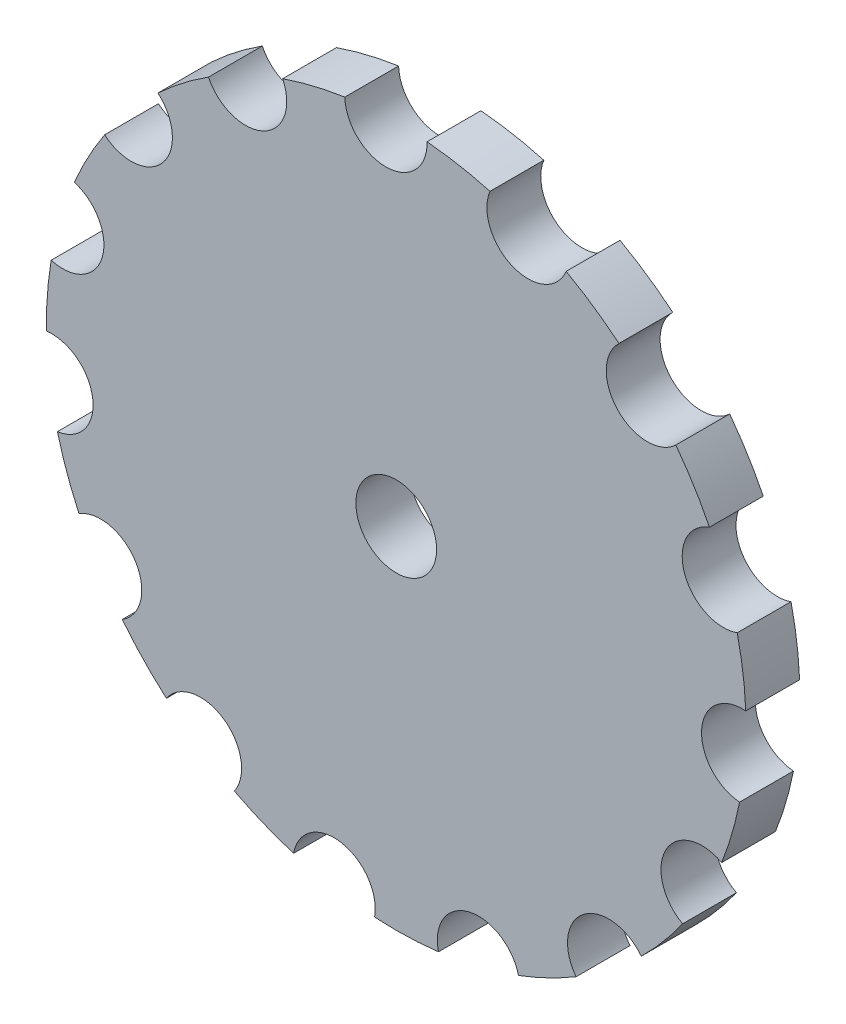
ISO-10303-21;
HEADER;
FILE_DESCRIPTION(('STEP AP214'),'2;1');
FILE_NAME('part.step','',(''),(''),'','','');
FILE_SCHEMA(('AUTOMOTIVE_DESIGN { 1 0 10303 214 1 1 1 1 }'));
ENDSEC;
DATA;
#1=APPLICATION_CONTEXT('core data for automotive mechanical design processes');
#2=APPLICATION_PROTOCOL_DEFINITION('international standard','automotive_design',2000,#1);
#3=PRODUCT_CONTEXT('',#1,'mechanical');
#4=PRODUCT('Part','Part','',(#3));
#5=PRODUCT_RELATED_PRODUCT_CATEGORY('part','',(#4));
#6=PRODUCT_DEFINITION_FORMATION('','',#4);
#7=PRODUCT_DEFINITION_CONTEXT('part definition',#1,'design');
#8=PRODUCT_DEFINITION('design','',#6,#7);
#9=PRODUCT_DEFINITION_SHAPE('','',#8);
#10=(LENGTH_UNIT() NAMED_UNIT(*) SI_UNIT(.MILLI.,.METRE.));
#11=(NAMED_UNIT(*) PLANE_ANGLE_UNIT() SI_UNIT($,.RADIAN.));
#12=(NAMED_UNIT(*) SI_UNIT($,.STERADIAN.) SOLID_ANGLE_UNIT());
#13=UNCERTAINTY_MEASURE_WITH_UNIT(LENGTH_MEASURE(1.E-05),#10,'distance_accuracy_value','');
#14=(GEOMETRIC_REPRESENTATION_CONTEXT(3) GLOBAL_UNCERTAINTY_ASSIGNED_CONTEXT((#13)) GLOBAL_UNIT_ASSIGNED_CONTEXT((#10,
#11,#12)) REPRESENTATION_CONTEXT('',''));
#15=CARTESIAN_POINT('',(0.,0.,0.));
#16=DIRECTION('',(0.,0.,1.));
#17=DIRECTION('',(1.,0.,0.));
#18=AXIS2_PLACEMENT_3D('',#15,#16,#17);
#19=CARTESIAN_POINT('',(0.,0.,10.));
#20=DIRECTION('',(0.,0.,-1.));
#21=DIRECTION('',(-1.,0.,0.));
#22=AXIS2_PLACEMENT_3D('',#19,#20,#21);
#23=CYLINDRICAL_SURFACE('',#22,65.);
#24=DIRECTION('',(0.,0.,-1.));
#25=VECTOR('',#24,1.);
#26=CARTESIAN_POINT('',(5.73085108240576,64.7468713211016,10.));
#27=LINE('',#26,#25);
#28=CARTESIAN_POINT('',(5.73085108240576,64.7468713211016,10.));
#29=VERTEX_POINT('',#28);
#30=CARTESIAN_POINT('',(5.73085108240576,64.7468713211016,0.));
#31=VERTEX_POINT('',#30);
#32=EDGE_CURVE('E505',#29,#31,#27,.T.);
#33=ORIENTED_EDGE('',*,*,#32,.F.);
#34=CARTESIAN_POINT('',(0.,0.,10.));
#35=DIRECTION('',(0.,0.,1.));
#36=DIRECTION('',(1.,0.,0.));
#37=AXIS2_PLACEMENT_3D('',#34,#35,#36);
#38=CIRCLE('',#37,65.);
#39=CARTESIAN_POINT('',(17.4188708905974,62.6225433601726,10.));
#40=VERTEX_POINT('',#39);
#41=EDGE_CURVE('E585',#40,#29,#38,.T.);
#42=ORIENTED_EDGE('',*,*,#41,.F.);
#43=DIRECTION('',(0.,0.,-1.));
#44=VECTOR('',#43,1.);
#45=CARTESIAN_POINT('',(17.4188708905974,62.6225433601726,10.));
#46=LINE('',#45,#44);
#47=CARTESIAN_POINT('',(17.4188708905974,62.6225433601726,0.));
#48=VERTEX_POINT('',#47);
#49=EDGE_CURVE('E502',#40,#48,#46,.T.);
#50=ORIENTED_EDGE('',*,*,#49,.T.);
#51=CARTESIAN_POINT('',(0.,0.,0.));
#52=DIRECTION('',(0.,0.,1.));
#53=DIRECTION('',(1.,0.,0.));
#54=AXIS2_PLACEMENT_3D('',#51,#52,#53);
#55=CIRCLE('',#54,65.);
#56=EDGE_CURVE('E345',#48,#31,#55,.T.);
#57=ORIENTED_EDGE('',*,*,#56,.T.);
#58=EDGE_LOOP('',(#33,#42,#50,#57));
#59=FACE_BOUND('',#58,.T.);
#60=ADVANCED_FACE('F40',(#59),#23,.T.);
#61=DIRECTION('',(0.,0.,-1.));
#62=VECTOR('',#61,1.);
#63=CARTESIAN_POINT('',(-9.55795268781716,64.2934331049249,10.));
#64=LINE('',#63,#62);
#65=CARTESIAN_POINT('',(-9.55795268781716,64.2934331049249,10.));
#66=VERTEX_POINT('',#65);
#67=CARTESIAN_POINT('',(-9.55795268781716,64.2934331049249,0.));
#68=VERTEX_POINT('',#67);
#69=EDGE_CURVE('E566',#66,#68,#64,.T.);
#70=ORIENTED_EDGE('',*,*,#69,.T.);
#71=CARTESIAN_POINT('',(-21.0995321160477,61.4801573231874,0.));
#72=VERTEX_POINT('',#71);
#73=EDGE_CURVE('E338',#68,#72,#55,.T.);
#74=ORIENTED_EDGE('',*,*,#73,.T.);
#75=DIRECTION('',(0.,0.,-1.));
#76=VECTOR('',#75,1.);
#77=CARTESIAN_POINT('',(-21.0995321160477,61.4801573231874,10.));
#78=LINE('',#77,#76);
#79=CARTESIAN_POINT('',(-21.0995321160477,61.4801573231874,10.));
#80=VERTEX_POINT('',#79);
#81=EDGE_CURVE('E419',#80,#72,#78,.T.);
#82=ORIENTED_EDGE('',*,*,#81,.F.);
#83=EDGE_CURVE('E581',#66,#80,#38,.T.);
#84=ORIENTED_EDGE('',*,*,#83,.F.);
#85=EDGE_LOOP('',(#70,#74,#82,#84));
#86=FACE_BOUND('',#85,.T.);
#87=ADVANCED_FACE('F651',(#86),#23,.T.);
#88=DIRECTION('',(0.,0.,-1.));
#89=VECTOR('',#88,1.);
#90=CARTESIAN_POINT('',(-34.8821194152339,54.8474041783325,10.));
#91=LINE('',#90,#89);
#92=CARTESIAN_POINT('',(-34.8821194152339,54.8474041783325,10.));
#93=VERTEX_POINT('',#92);
#94=CARTESIAN_POINT('',(-34.8821194152339,54.8474041783325,0.));
#95=VERTEX_POINT('',#94);
#96=EDGE_CURVE('E417',#93,#95,#91,.T.);
#97=ORIENTED_EDGE('',*,*,#96,.T.);
#98=CARTESIAN_POINT('',(-44.2816145284048,47.5829655943991,0.));
#99=VERTEX_POINT('',#98);
#100=EDGE_CURVE('E291',#95,#99,#55,.T.);
#101=ORIENTED_EDGE('',*,*,#100,.T.);
#102=DIRECTION('',(0.,0.,-1.));
#103=VECTOR('',#102,1.);
#104=CARTESIAN_POINT('',(-44.2816145284049,47.5829655943991,10.));
#105=LINE('',#104,#103);
#106=CARTESIAN_POINT('',(-44.2816145284049,47.5829655943991,10.));
#107=VERTEX_POINT('',#106);
#108=EDGE_CURVE('E425',#107,#99,#105,.T.);
#109=ORIENTED_EDGE('',*,*,#108,.F.);
#110=EDGE_CURVE('E423',#93,#107,#38,.T.);
#111=ORIENTED_EDGE('',*,*,#110,.F.);
#112=EDGE_LOOP('',(#97,#101,#109,#111));
#113=FACE_BOUND('',#112,.T.);
#114=ADVANCED_FACE('F421',(#113),#23,.T.);
#115=DIRECTION('',(0.,0.,-1.));
#116=VECTOR('',#115,1.);
#117=CARTESIAN_POINT('',(-54.1748508016503,35.917760796282,10.));
#118=LINE('',#117,#116);
#119=CARTESIAN_POINT('',(-54.1748508016503,35.917760796282,10.));
#120=VERTEX_POINT('',#119);
#121=CARTESIAN_POINT('',(-54.1748508016503,35.917760796282,0.));
#122=VERTEX_POINT('',#121);
#123=EDGE_CURVE('E444',#120,#122,#118,.T.);
#124=ORIENTED_EDGE('',*,*,#123,.T.);
#125=CARTESIAN_POINT('',(0.,0.,0.));
#126=DIRECTION('',(0.,0.,-1.));
#127=DIRECTION('',(-1.,0.,0.));
#128=AXIS2_PLACEMENT_3D('',#125,#126,#127);
#129=CIRCLE('',#128,65.);
#130=CARTESIAN_POINT('',(-59.807003502962,25.4582468366675,0.));
#131=VERTEX_POINT('',#130);
#132=EDGE_CURVE('E43',#122,#131,#129,.F.);
#133=ORIENTED_EDGE('',*,*,#132,.T.);
#134=DIRECTION('',(0.,0.,-1.));
#135=VECTOR('',#134,1.);
#136=CARTESIAN_POINT('',(-59.807003502962,25.4582468366675,10.));
#137=LINE('',#136,#135);
#138=CARTESIAN_POINT('',(-59.807003502962,25.4582468366675,10.));
#139=VERTEX_POINT('',#138);
#140=EDGE_CURVE('E434',#139,#131,#137,.T.);
#141=ORIENTED_EDGE('',*,*,#140,.F.);
#142=EDGE_CURVE('E582',#120,#139,#38,.T.);
#143=ORIENTED_EDGE('',*,*,#142,.F.);
#144=EDGE_LOOP('',(#124,#133,#141,#143));
#145=FACE_BOUND('',#144,.T.);
#146=ADVANCED_FACE('F901',(#145),#23,.T.);
#147=DIRECTION('',(0.,0.,-1.));
#148=VECTOR('',#147,1.);
#149=CARTESIAN_POINT('',(-64.1002583213925,10.7776102699413,10.));
#150=LINE('',#149,#148);
#151=CARTESIAN_POINT('',(-64.1002583213925,10.7776102699413,10.));
#152=VERTEX_POINT('',#151);
#153=CARTESIAN_POINT('',(-64.1002583213925,10.7776102699413,0.));
#154=VERTEX_POINT('',#153);
#155=EDGE_CURVE('E432',#152,#154,#150,.T.);
#156=ORIENTED_EDGE('',*,*,#155,.T.);
#157=CARTESIAN_POINT('',(-64.9912182422873,-1.06843408003571,0.));
#158=VERTEX_POINT('',#157);
#159=EDGE_CURVE('E294',#154,#158,#55,.T.);
#160=ORIENTED_EDGE('',*,*,#159,.T.);
#161=DIRECTION('',(0.,0.,-1.));
#162=VECTOR('',#161,1.);
#163=CARTESIAN_POINT('',(-64.9912182422873,-1.06843408003572,10.));
#164=LINE('',#163,#162);
#165=CARTESIAN_POINT('',(-64.9912182422873,-1.06843408003572,10.));
#166=VERTEX_POINT('',#165);
#167=EDGE_CURVE('E440',#166,#158,#164,.T.);
#168=ORIENTED_EDGE('',*,*,#167,.F.);
#169=EDGE_CURVE('E438',#152,#166,#38,.T.);
#170=ORIENTED_EDGE('',*,*,#169,.F.);
#171=EDGE_LOOP('',(#156,#160,#168,#170));
#172=FACE_BOUND('',#171,.T.);
#173=ADVANCED_FACE('F436',(#172),#23,.T.);
#174=DIRECTION('',(0.,0.,-1.));
#175=VECTOR('',#174,1.);
#176=CARTESIAN_POINT('',(-62.9421488448007,-16.2260869835877,10.));
#177=LINE('',#176,#175);
#178=CARTESIAN_POINT('',(-62.9421488448007,-16.2260869835877,10.));
#179=VERTEX_POINT('',#178);
#180=CARTESIAN_POINT('',(-62.9421488448007,-16.2260869835877,0.));
#181=VERTEX_POINT('',#180);
#182=EDGE_CURVE('E446',#179,#181,#177,.T.);
#183=ORIENTED_EDGE('',*,*,#182,.T.);
#184=CARTESIAN_POINT('',(-58.937860920839,-27.4103730378818,0.));
#185=VERTEX_POINT('',#184);
#186=EDGE_CURVE('E302',#181,#185,#55,.T.);
#187=ORIENTED_EDGE('',*,*,#186,.T.);
#188=DIRECTION('',(0.,0.,-1.));
#189=VECTOR('',#188,1.);
#190=CARTESIAN_POINT('',(-58.937860920839,-27.4103730378818,10.));
#191=LINE('',#190,#189);
#192=CARTESIAN_POINT('',(-58.937860920839,-27.4103730378818,10.));
#193=VERTEX_POINT('',#192);
#194=EDGE_CURVE('E452',#193,#185,#191,.T.);
#195=ORIENTED_EDGE('',*,*,#194,.F.);
#196=EDGE_CURVE('E587',#179,#193,#38,.T.);
#197=ORIENTED_EDGE('',*,*,#196,.F.);
#198=EDGE_LOOP('',(#183,#187,#195,#197));
#199=FACE_BOUND('',#198,.T.);
#200=ADVANCED_FACE('F886',(#199),#23,.T.);
#201=DIRECTION('',(0.,0.,-1.));
#202=VECTOR('',#201,1.);
#203=CARTESIAN_POINT('',(-50.9007700214718,-40.4241463882819,10.));
#204=LINE('',#203,#202);
#205=CARTESIAN_POINT('',(-50.9007700214718,-40.4241463882819,10.));
#206=VERTEX_POINT('',#205);
#207=CARTESIAN_POINT('',(-50.9007700214718,-40.4241463882819,0.));
#208=VERTEX_POINT('',#207);
#209=EDGE_CURVE('E455',#206,#208,#204,.T.);
#210=ORIENTED_EDGE('',*,*,#209,.T.);
#211=CARTESIAN_POINT('',(-42.6936120125204,-49.0128094820566,0.));
#212=VERTEX_POINT('',#211);
#213=EDGE_CURVE('E305',#208,#212,#55,.T.);
#214=ORIENTED_EDGE('',*,*,#213,.T.);
#215=DIRECTION('',(0.,0.,-1.));
#216=VECTOR('',#215,1.);
#217=CARTESIAN_POINT('',(-42.6936120125204,-49.0128094820566,10.));
#218=LINE('',#217,#216);
#219=CARTESIAN_POINT('',(-42.6936120125204,-49.0128094820566,10.));
#220=VERTEX_POINT('',#219);
#221=EDGE_CURVE('E458',#220,#212,#218,.T.);
#222=ORIENTED_EDGE('',*,*,#221,.F.);
#223=EDGE_CURVE('E591',#206,#220,#38,.T.);
#224=ORIENTED_EDGE('',*,*,#223,.F.);
#225=EDGE_LOOP('',(#210,#214,#222,#224));
#226=FACE_BOUND('',#225,.T.);
#227=ADVANCED_FACE('F693',(#226),#23,.T.);
#228=DIRECTION('',(0.,0.,-1.));
#229=VECTOR('',#228,1.);
#230=CARTESIAN_POINT('',(-30.0581856424517,-57.6325036406012,10.));
#231=LINE('',#230,#229);
#232=CARTESIAN_POINT('',(-30.0581856424517,-57.6325036406012,10.));
#233=VERTEX_POINT('',#232);
#234=CARTESIAN_POINT('',(-30.0581856424517,-57.6325036406012,0.));
#235=VERTEX_POINT('',#234);
#236=EDGE_CURVE('E461',#233,#235,#231,.T.);
#237=ORIENTED_EDGE('',*,*,#236,.T.);
#238=CARTESIAN_POINT('',(-19.0672497279481,-62.1404858993882,0.));
#239=VERTEX_POINT('',#238);
#240=EDGE_CURVE('E276',#235,#239,#55,.T.);
#241=ORIENTED_EDGE('',*,*,#240,.T.);
#242=DIRECTION('',(0.,0.,-1.));
#243=VECTOR('',#242,1.);
#244=CARTESIAN_POINT('',(-19.0672497279481,-62.1404858993882,10.));
#245=LINE('',#244,#243);
#246=CARTESIAN_POINT('',(-19.0672497279481,-62.1404858993882,10.));
#247=VERTEX_POINT('',#246);
#248=EDGE_CURVE('E464',#247,#239,#245,.T.);
#249=ORIENTED_EDGE('',*,*,#248,.F.);
#250=EDGE_CURVE('E596',#233,#247,#38,.T.);
#251=ORIENTED_EDGE('',*,*,#250,.F.);
#252=EDGE_LOOP('',(#237,#241,#249,#251));
#253=FACE_BOUND('',#252,.T.);
#254=ADVANCED_FACE('F688',(#253),#23,.T.);
#255=DIRECTION('',(0.,0.,-1.));
#256=VECTOR('',#255,1.);
#257=CARTESIAN_POINT('',(-4.01826789580786,-64.8756774386019,10.));
#258=LINE('',#257,#256);
#259=CARTESIAN_POINT('',(-4.01826789580786,-64.8756774386019,10.));
#260=VERTEX_POINT('',#259);
#261=CARTESIAN_POINT('',(-4.01826789580786,-64.8756774386019,0.));
#262=VERTEX_POINT('',#261);
#263=EDGE_CURVE('E467',#260,#262,#258,.T.);
#264=ORIENTED_EDGE('',*,*,#263,.T.);
#265=CARTESIAN_POINT('',(7.85601325511217,-64.5235077761238,0.));
#266=VERTEX_POINT('',#265);
#267=EDGE_CURVE('E271',#262,#266,#55,.T.);
#268=ORIENTED_EDGE('',*,*,#267,.T.);
#269=DIRECTION('',(0.,0.,-1.));
#270=VECTOR('',#269,1.);
#271=CARTESIAN_POINT('',(7.85601325511217,-64.5235077761238,10.));
#272=LINE('',#271,#270);
#273=CARTESIAN_POINT('',(7.85601325511217,-64.5235077761238,10.));
#274=VERTEX_POINT('',#273);
#275=EDGE_CURVE('E471',#274,#266,#272,.T.);
#276=ORIENTED_EDGE('',*,*,#275,.F.);
#277=EDGE_CURVE('E601',#260,#274,#38,.T.);
#278=ORIENTED_EDGE('',*,*,#277,.F.);
#279=EDGE_LOOP('',(#264,#268,#276,#278));
#280=FACE_BOUND('',#279,.T.);
#281=ADVANCED_FACE('F684',(#280),#23,.T.);
#282=DIRECTION('',(0.,0.,-1.));
#283=VECTOR('',#282,1.);
#284=CARTESIAN_POINT('',(22.716444874839,-60.9012572304415,10.));
#285=LINE('',#284,#283);
#286=CARTESIAN_POINT('',(22.716444874839,-60.9012572304415,10.));
#287=VERTEX_POINT('',#286);
#288=CARTESIAN_POINT('',(22.716444874839,-60.9012572304415,0.));
#289=VERTEX_POINT('',#288);
#290=EDGE_CURVE('E251',#287,#289,#285,.T.);
#291=ORIENTED_EDGE('',*,*,#290,.T.);
#292=CARTESIAN_POINT('',(33.4209001767236,-55.7498289807016,0.));
#293=VERTEX_POINT('',#292);
#294=EDGE_CURVE('E260',#289,#293,#55,.T.);
#295=ORIENTED_EDGE('',*,*,#294,.T.);
#296=DIRECTION('',(0.,0.,-1.));
#297=VECTOR('',#296,1.);
#298=CARTESIAN_POINT('',(33.4209001767236,-55.7498289807016,10.));
#299=LINE('',#298,#297);
#300=CARTESIAN_POINT('',(33.4209001767236,-55.7498289807016,10.));
#301=VERTEX_POINT('',#300);
#302=EDGE_CURVE('E239',#301,#293,#299,.T.);
#303=ORIENTED_EDGE('',*,*,#302,.F.);
#304=EDGE_CURVE('E606',#287,#301,#38,.T.);
#305=ORIENTED_EDGE('',*,*,#304,.F.);
#306=EDGE_LOOP('',(#291,#295,#303,#305));
#307=FACE_BOUND('',#306,.T.);
#308=ADVANCED_FACE('F269',(#307),#23,.T.);
#309=DIRECTION('',(0.,0.,-1.));
#310=VECTOR('',#309,1.);
#311=CARTESIAN_POINT('',(45.5232779542033,-46.3964563765849,10.));
#312=LINE('',#311,#310);
#313=CARTESIAN_POINT('',(45.5232779542033,-46.3964563765849,10.));
#314=VERTEX_POINT('',#313);
#315=CARTESIAN_POINT('',(45.5232779542033,-46.3964563765849,0.));
#316=VERTEX_POINT('',#315);
#317=EDGE_CURVE('E252',#314,#316,#312,.T.);
#318=ORIENTED_EDGE('',*,*,#317,.T.);
#319=CARTESIAN_POINT('',(53.2070098384332,-37.3364982832198,0.));
#320=VERTEX_POINT('',#319);
#321=EDGE_CURVE('E263',#316,#320,#55,.T.);
#322=ORIENTED_EDGE('',*,*,#321,.T.);
#323=DIRECTION('',(0.,0.,-1.));
#324=VECTOR('',#323,1.);
#325=CARTESIAN_POINT('',(53.2070098384332,-37.3364982832198,10.));
#326=LINE('',#325,#324);
#327=CARTESIAN_POINT('',(53.2070098384332,-37.3364982832198,10.));
#328=VERTEX_POINT('',#327);
#329=EDGE_CURVE('E478',#328,#320,#326,.T.);
#330=ORIENTED_EDGE('',*,*,#329,.F.);
#331=EDGE_CURVE('E610',#314,#328,#38,.T.);
#332=ORIENTED_EDGE('',*,*,#331,.F.);
#333=EDGE_LOOP('',(#318,#322,#330,#332));
#334=FACE_BOUND('',#333,.T.);
#335=ADVANCED_FACE('F671',(#334),#23,.T.);
#336=DIRECTION('',(0.,0.,-1.));
#337=VECTOR('',#336,1.);
#338=CARTESIAN_POINT('',(60.4587227092889,-23.8692867166431,10.));
#339=LINE('',#338,#337);
#340=CARTESIAN_POINT('',(60.4587227092889,-23.8692867166431,10.));
#341=VERTEX_POINT('',#340);
#342=CARTESIAN_POINT('',(60.4587227092889,-23.8692867166431,0.));
#343=VERTEX_POINT('',#342);
#344=EDGE_CURVE('E481',#341,#343,#339,.T.);
#345=ORIENTED_EDGE('',*,*,#344,.T.);
#346=CARTESIAN_POINT('',(63.793144128568,-12.4673478411308,0.));
#347=VERTEX_POINT('',#346);
#348=EDGE_CURVE('E278',#343,#347,#55,.T.);
#349=ORIENTED_EDGE('',*,*,#348,.T.);
#350=DIRECTION('',(0.,0.,-1.));
#351=VECTOR('',#350,1.);
#352=CARTESIAN_POINT('',(63.793144128568,-12.4673478411308,10.));
#353=LINE('',#352,#351);
#354=CARTESIAN_POINT('',(63.793144128568,-12.4673478411308,10.));
#355=VERTEX_POINT('',#354);
#356=EDGE_CURVE('E58',#355,#347,#353,.T.);
#357=ORIENTED_EDGE('',*,*,#356,.F.);
#358=EDGE_CURVE('E289',#341,#355,#38,.T.);
#359=ORIENTED_EDGE('',*,*,#358,.F.);
#360=EDGE_LOOP('',(#345,#349,#357,#359));
#361=FACE_BOUND('',#360,.T.);
#362=ADVANCED_FACE('F666',(#361),#23,.T.);
#363=DIRECTION('',(0.,0.,-1.));
#364=VECTOR('',#363,1.);
#365=CARTESIAN_POINT('',(64.9403050576856,2.78509946226872,10.));
#366=LINE('',#365,#364);
#367=CARTESIAN_POINT('',(64.9403050576856,2.78509946226872,10.));
#368=VERTEX_POINT('',#367);
#369=CARTESIAN_POINT('',(64.9403050576856,2.78509946226872,0.));
#370=VERTEX_POINT('',#369);
#371=EDGE_CURVE('E485',#368,#370,#366,.T.);
#372=ORIENTED_EDGE('',*,*,#371,.T.);
#373=CARTESIAN_POINT('',(63.3488642563529,14.5575203049891,0.));
#374=VERTEX_POINT('',#373);
#375=EDGE_CURVE('E283',#370,#374,#55,.T.);
#376=ORIENTED_EDGE('',*,*,#375,.T.);
#377=DIRECTION('',(0.,0.,-1.));
#378=VECTOR('',#377,1.);
#379=CARTESIAN_POINT('',(63.3488642563529,14.5575203049891,10.));
#380=LINE('',#379,#378);
#381=CARTESIAN_POINT('',(63.3488642563529,14.5575203049891,10.));
#382=VERTEX_POINT('',#381);
#383=EDGE_CURVE('E489',#382,#374,#380,.T.);
#384=ORIENTED_EDGE('',*,*,#383,.F.);
#385=EDGE_CURVE('E292',#368,#382,#38,.T.);
#386=ORIENTED_EDGE('',*,*,#385,.F.);
#387=EDGE_LOOP('',(#372,#376,#384,#386));
#388=FACE_BOUND('',#387,.T.);
#389=ADVANCED_FACE('F662',(#388),#23,.T.);
#390=DIRECTION('',(0.,0.,-1.));
#391=VECTOR('',#390,1.);
#392=CARTESIAN_POINT('',(58.1931186974581,28.9579166423199,10.));
#393=LINE('',#392,#391);
#394=CARTESIAN_POINT('',(58.1931186974581,28.9579166423199,10.));
#395=VERTEX_POINT('',#394);
#396=CARTESIAN_POINT('',(58.1931186974581,28.9579166423199,0.));
#397=VERTEX_POINT('',#396);
#398=EDGE_CURVE('E372',#395,#397,#393,.T.);
#399=ORIENTED_EDGE('',*,*,#398,.T.);
#400=CARTESIAN_POINT('',(51.9509902478498,39.0652609394563,0.));
#401=VERTEX_POINT('',#400);
#402=EDGE_CURVE('E290',#397,#401,#55,.T.);
#403=ORIENTED_EDGE('',*,*,#402,.T.);
#404=DIRECTION('',(0.,0.,-1.));
#405=VECTOR('',#404,1.);
#406=CARTESIAN_POINT('',(51.9509902478499,39.0652609394563,10.));
#407=LINE('',#406,#405);
#408=CARTESIAN_POINT('',(51.9509902478499,39.0652609394563,10.));
#409=VERTEX_POINT('',#408);
#410=EDGE_CURVE('E370',#409,#401,#407,.T.);
#411=ORIENTED_EDGE('',*,*,#410,.F.);
#412=EDGE_CURVE('E621',#395,#409,#38,.T.);
#413=ORIENTED_EDGE('',*,*,#412,.F.);
#414=EDGE_LOOP('',(#399,#403,#411,#413));
#415=FACE_BOUND('',#414,.T.);
#416=ADVANCED_FACE('F368',(#415),#23,.T.);
#417=DIRECTION('',(0.,0.,-1.));
#418=VECTOR('',#417,1.);
#419=CARTESIAN_POINT('',(41.3838134465536,50.1236469605001,10.));
#420=LINE('',#419,#418);
#421=CARTESIAN_POINT('',(41.3838134465536,50.1236469605001,10.));
#422=VERTEX_POINT('',#421);
#423=CARTESIAN_POINT('',(41.3838134465536,50.1236469605001,0.));
#424=VERTEX_POINT('',#423);
#425=EDGE_CURVE('E496',#422,#424,#420,.T.);
#426=ORIENTED_EDGE('',*,*,#425,.T.);
#427=CARTESIAN_POINT('',(31.5703180655636,56.8182630607374,0.));
#428=VERTEX_POINT('',#427);
#429=EDGE_CURVE('E352',#424,#428,#55,.T.);
#430=ORIENTED_EDGE('',*,*,#429,.T.);
#431=DIRECTION('',(0.,0.,-1.));
#432=VECTOR('',#431,1.);
#433=CARTESIAN_POINT('',(31.5703180655636,56.8182630607373,10.));
#434=LINE('',#433,#432);
#435=CARTESIAN_POINT('',(31.5703180655636,56.8182630607373,10.));
#436=VERTEX_POINT('',#435);
#437=EDGE_CURVE('E499',#436,#428,#434,.T.);
#438=ORIENTED_EDGE('',*,*,#437,.F.);
#439=EDGE_CURVE('E625',#422,#436,#38,.T.);
#440=ORIENTED_EDGE('',*,*,#439,.F.);
#441=EDGE_LOOP('',(#426,#430,#438,#440));
#442=FACE_BOUND('',#441,.T.);
#443=ADVANCED_FACE('F637',(#442),#23,.T.);
#444=CARTESIAN_POINT('',(0.,0.,10.));
#445=DIRECTION('',(0.,0.,1.));
#446=DIRECTION('',(1.,0.,0.));
#447=AXIS2_PLACEMENT_3D('',#444,#445,#446);
#448=PLANE('',#447);
#449=CARTESIAN_POINT('',(0.,0.,10.));
#450=DIRECTION('',(0.,0.,1.));
#451=DIRECTION('',(1.,0.,0.));
#452=AXIS2_PLACEMENT_3D('',#449,#450,#451);
#453=CIRCLE('',#452,7.5);
#454=CARTESIAN_POINT('',(7.5,0.,10.));
#455=VERTEX_POINT('',#454);
#456=EDGE_CURVE('E559',#455,#455,#453,.T.);
#457=ORIENTED_EDGE('',*,*,#456,.F.);
#458=EDGE_LOOP('',(#457));
#459=FACE_BOUND('',#458,.T.);
#460=ORIENTED_EDGE('',*,*,#41,.T.);
#461=CARTESIAN_POINT('',(-1.91355080270567,64.5201522130132,10.));
#462=DIRECTION('',(0.,0.,1.));
#463=DIRECTION('',(-1.,0.,0.));
#464=AXIS2_PLACEMENT_3D('',#461,#462,#463);
#465=CIRCLE('',#464,7.6477631850802);
#466=EDGE_CURVE('E80',#66,#29,#465,.T.);
#467=ORIENTED_EDGE('',*,*,#466,.F.);
#468=ORIENTED_EDGE('',*,*,#83,.T.);
#469=CARTESIAN_POINT('',(-27.9908257656408,58.1637807507599,10.));
#470=DIRECTION('',(0.,0.,1.));
#471=DIRECTION('',(-1.,0.,0.));
#472=AXIS2_PLACEMENT_3D('',#469,#470,#471);
#473=CIRCLE('',#472,7.6477631850802);
#474=EDGE_CURVE('E507',#93,#80,#473,.T.);
#475=ORIENTED_EDGE('',*,*,#474,.F.);
#476=ORIENTED_EDGE('',*,*,#110,.T.);
#477=CARTESIAN_POINT('',(-49.2282326650276,41.7503631953405,10.));
#478=DIRECTION('',(0.,0.,1.));
#479=DIRECTION('',(-1.,0.,0.));
#480=AXIS2_PLACEMENT_3D('',#477,#478,#479);
#481=CIRCLE('',#480,7.6477631850802);
#482=EDGE_CURVE('E515',#120,#107,#481,.T.);
#483=ORIENTED_EDGE('',*,*,#482,.F.);
#484=ORIENTED_EDGE('',*,*,#142,.T.);
#485=CARTESIAN_POINT('',(-61.9536309121773,18.1179285533044,10.));
#486=DIRECTION('',(0.,0.,1.));
#487=DIRECTION('',(-1.,0.,0.));
#488=AXIS2_PLACEMENT_3D('',#485,#486,#487);
#489=CIRCLE('',#488,7.6477631850802);
#490=EDGE_CURVE('E518',#152,#139,#489,.T.);
#491=ORIENTED_EDGE('',*,*,#490,.F.);
#492=ORIENTED_EDGE('',*,*,#169,.T.);
#493=CARTESIAN_POINT('',(-63.966683543544,-8.64726053181169,10.));
#494=DIRECTION('',(0.,0.,1.));
#495=DIRECTION('',(-1.,0.,0.));
#496=AXIS2_PLACEMENT_3D('',#493,#494,#495);
#497=CIRCLE('',#496,7.6477631850802);
#498=EDGE_CURVE('E521',#179,#166,#497,.T.);
#499=ORIENTED_EDGE('',*,*,#498,.F.);
#500=ORIENTED_EDGE('',*,*,#196,.T.);
#501=CARTESIAN_POINT('',(-54.9193154711554,-33.9172597130818,10.));
#502=DIRECTION('',(0.,0.,1.));
#503=DIRECTION('',(-1.,0.,0.));
#504=AXIS2_PLACEMENT_3D('',#501,#502,#503);
#505=CIRCLE('',#504,7.6477631850802);
#506=EDGE_CURVE('E524',#206,#193,#505,.T.);
#507=ORIENTED_EDGE('',*,*,#506,.F.);
#508=ORIENTED_EDGE('',*,*,#223,.T.);
#509=CARTESIAN_POINT('',(-36.3758988274861,-53.3226565613289,10.));
#510=DIRECTION('',(0.,0.,1.));
#511=DIRECTION('',(-1.,0.,0.));
#512=AXIS2_PLACEMENT_3D('',#509,#510,#511);
#513=CIRCLE('',#512,7.64776318508019);
#514=EDGE_CURVE('E527',#233,#220,#513,.T.);
#515=ORIENTED_EDGE('',*,*,#514,.F.);
#516=ORIENTED_EDGE('',*,*,#250,.T.);
#517=CARTESIAN_POINT('',(-11.542758811878,-63.508081668995,10.));
#518=DIRECTION('',(0.,0.,1.));
#519=DIRECTION('',(-1.,0.,0.));
#520=AXIS2_PLACEMENT_3D('',#517,#518,#519);
#521=CIRCLE('',#520,7.64776318508021);
#522=EDGE_CURVE('E530',#260,#247,#521,.T.);
#523=ORIENTED_EDGE('',*,*,#522,.F.);
#524=ORIENTED_EDGE('',*,*,#277,.T.);
#525=CARTESIAN_POINT('',(15.2862290649756,-62.7123825032826,10.));
#526=DIRECTION('',(0.,0.,1.));
#527=DIRECTION('',(-1.,0.,0.));
#528=AXIS2_PLACEMENT_3D('',#525,#526,#527);
#529=CIRCLE('',#528,7.64776318508021);
#530=EDGE_CURVE('E533',#287,#274,#529,.T.);
#531=ORIENTED_EDGE('',*,*,#530,.F.);
#532=ORIENTED_EDGE('',*,*,#304,.T.);
#533=CARTESIAN_POINT('',(39.4720890654635,-51.0731426786433,10.));
#534=DIRECTION('',(0.,0.,1.));
#535=DIRECTION('',(-1.,0.,0.));
#536=AXIS2_PLACEMENT_3D('',#533,#534,#535);
#537=CIRCLE('',#536,7.64776318508019);
#538=EDGE_CURVE('E245',#314,#301,#537,.T.);
#539=ORIENTED_EDGE('',*,*,#538,.F.);
#540=ORIENTED_EDGE('',*,*,#331,.T.);
#541=CARTESIAN_POINT('',(56.8328662738611,-30.6028924999314,10.));
#542=DIRECTION('',(0.,0.,1.));
#543=DIRECTION('',(-1.,0.,0.));
#544=AXIS2_PLACEMENT_3D('',#541,#542,#543);
#545=CIRCLE('',#544,7.64776318508019);
#546=EDGE_CURVE('E538',#341,#328,#545,.T.);
#547=ORIENTED_EDGE('',*,*,#546,.F.);
#548=ORIENTED_EDGE('',*,*,#358,.T.);
#549=CARTESIAN_POINT('',(64.3667245931268,-4.84112418943104,10.));
#550=DIRECTION('',(0.,0.,1.));
#551=DIRECTION('',(-1.,0.,0.));
#552=AXIS2_PLACEMENT_3D('',#549,#550,#551);
#553=CIRCLE('',#552,7.64776318508022);
#554=EDGE_CURVE('E541',#368,#355,#553,.T.);
#555=ORIENTED_EDGE('',*,*,#554,.F.);
#556=ORIENTED_EDGE('',*,*,#385,.T.);
#557=CARTESIAN_POINT('',(60.7709914769055,21.7577184736545,10.));
#558=DIRECTION('',(0.,0.,1.));
#559=DIRECTION('',(-1.,0.,0.));
#560=AXIS2_PLACEMENT_3D('',#557,#558,#559);
#561=CIRCLE('',#560,7.64776318508019);
#562=EDGE_CURVE('E544',#395,#382,#561,.T.);
#563=ORIENTED_EDGE('',*,*,#562,.F.);
#564=ORIENTED_EDGE('',*,*,#412,.T.);
#565=CARTESIAN_POINT('',(46.6674018472017,44.5944539499782,10.));
#566=DIRECTION('',(0.,0.,1.));
#567=DIRECTION('',(-1.,0.,0.));
#568=AXIS2_PLACEMENT_3D('',#565,#566,#567);
#569=CIRCLE('',#568,7.6477631850802);
#570=EDGE_CURVE('E547',#422,#409,#569,.T.);
#571=ORIENTED_EDGE('',*,*,#570,.F.);
#572=ORIENTED_EDGE('',*,*,#439,.T.);
#573=CARTESIAN_POINT('',(24.4945944780805,59.720403210455,10.));
#574=DIRECTION('',(0.,0.,1.));
#575=DIRECTION('',(-1.,0.,0.));
#576=AXIS2_PLACEMENT_3D('',#573,#574,#575);
#577=CIRCLE('',#576,7.6477631850802);
#578=EDGE_CURVE('E550',#40,#436,#577,.T.);
#579=ORIENTED_EDGE('',*,*,#578,.F.);
#580=EDGE_LOOP('',(#460,#467,#468,#475,#476,#483,#484,#491,#492,#499,#500,#507,#508,#515,#516,
#523,#524,#531,#532,#539,#540,#547,#548,#555,#556,#563,#564,#571,#572,#579));
#581=FACE_BOUND('',#580,.T.);
#582=ADVANCED_FACE('F576',(#459,#581),#448,.T.);
#583=CARTESIAN_POINT('',(0.,0.,0.));
#584=DIRECTION('',(0.,0.,1.));
#585=DIRECTION('',(1.,0.,0.));
#586=AXIS2_PLACEMENT_3D('',#583,#584,#585);
#587=PLANE('',#586);
#588=CARTESIAN_POINT('',(0.,0.,0.));
#589=DIRECTION('',(0.,0.,1.));
#590=DIRECTION('',(1.,0.,0.));
#591=AXIS2_PLACEMENT_3D('',#588,#589,#590);
#592=CIRCLE('',#591,7.5);
#593=CARTESIAN_POINT('',(7.5,0.,0.));
#594=VERTEX_POINT('',#593);
#595=EDGE_CURVE('E555',#594,#594,#592,.T.);
#596=ORIENTED_EDGE('',*,*,#595,.T.);
#597=EDGE_LOOP('',(#596));
#598=FACE_BOUND('',#597,.T.);
#599=CARTESIAN_POINT('',(-1.91355080270567,64.5201522130132,0.));
#600=DIRECTION('',(0.,0.,1.));
#601=DIRECTION('',(1.,0.,0.));
#602=AXIS2_PLACEMENT_3D('',#599,#600,#601);
#603=CIRCLE('',#602,7.6477631850802);
#604=EDGE_CURVE('E12',#31,#68,#603,.F.);
#605=ORIENTED_EDGE('',*,*,#604,.F.);
#606=ORIENTED_EDGE('',*,*,#56,.F.);
#607=CARTESIAN_POINT('',(24.4945944780805,59.720403210455,0.));
#608=DIRECTION('',(0.,0.,1.));
#609=DIRECTION('',(1.,0.,0.));
#610=AXIS2_PLACEMENT_3D('',#607,#608,#609);
#611=CIRCLE('',#610,7.6477631850802);
#612=EDGE_CURVE('E381',#428,#48,#611,.F.);
#613=ORIENTED_EDGE('',*,*,#612,.F.);
#614=ORIENTED_EDGE('',*,*,#429,.F.);
#615=CARTESIAN_POINT('',(46.6674018472017,44.5944539499782,0.));
#616=DIRECTION('',(0.,0.,1.));
#617=DIRECTION('',(1.,0.,0.));
#618=AXIS2_PLACEMENT_3D('',#615,#616,#617);
#619=CIRCLE('',#618,7.6477631850802);
#620=EDGE_CURVE('E377',#401,#424,#619,.F.);
#621=ORIENTED_EDGE('',*,*,#620,.F.);
#622=ORIENTED_EDGE('',*,*,#402,.F.);
#623=CARTESIAN_POINT('',(60.7709914769055,21.7577184736545,0.));
#624=DIRECTION('',(0.,0.,1.));
#625=DIRECTION('',(1.,0.,0.));
#626=AXIS2_PLACEMENT_3D('',#623,#624,#625);
#627=CIRCLE('',#626,7.64776318508019);
#628=EDGE_CURVE('E376',#374,#397,#627,.F.);
#629=ORIENTED_EDGE('',*,*,#628,.F.);
#630=ORIENTED_EDGE('',*,*,#375,.F.);
#631=CARTESIAN_POINT('',(64.3667245931268,-4.84112418943104,0.));
#632=DIRECTION('',(0.,0.,1.));
#633=DIRECTION('',(1.,0.,0.));
#634=AXIS2_PLACEMENT_3D('',#631,#632,#633);
#635=CIRCLE('',#634,7.64776318508022);
#636=EDGE_CURVE('E385',#347,#370,#635,.F.);
#637=ORIENTED_EDGE('',*,*,#636,.F.);
#638=ORIENTED_EDGE('',*,*,#348,.F.);
#639=CARTESIAN_POINT('',(56.8328662738611,-30.6028924999314,0.));
#640=DIRECTION('',(0.,0.,1.));
#641=DIRECTION('',(1.,0.,0.));
#642=AXIS2_PLACEMENT_3D('',#639,#640,#641);
#643=CIRCLE('',#642,7.64776318508019);
#644=EDGE_CURVE('E266',#320,#343,#643,.F.);
#645=ORIENTED_EDGE('',*,*,#644,.F.);
#646=ORIENTED_EDGE('',*,*,#321,.F.);
#647=CARTESIAN_POINT('',(39.4720890654635,-51.0731426786433,0.));
#648=DIRECTION('',(0.,0.,1.));
#649=DIRECTION('',(1.,0.,0.));
#650=AXIS2_PLACEMENT_3D('',#647,#648,#649);
#651=CIRCLE('',#650,7.64776318508019);
#652=EDGE_CURVE('E242',#293,#316,#651,.F.);
#653=ORIENTED_EDGE('',*,*,#652,.F.);
#654=ORIENTED_EDGE('',*,*,#294,.F.);
#655=CARTESIAN_POINT('',(15.2862290649756,-62.7123825032826,0.));
#656=DIRECTION('',(0.,0.,1.));
#657=DIRECTION('',(1.,0.,0.));
#658=AXIS2_PLACEMENT_3D('',#655,#656,#657);
#659=CIRCLE('',#658,7.64776318508021);
#660=EDGE_CURVE('E265',#266,#289,#659,.F.);
#661=ORIENTED_EDGE('',*,*,#660,.F.);
#662=ORIENTED_EDGE('',*,*,#267,.F.);
#663=CARTESIAN_POINT('',(-11.542758811878,-63.508081668995,0.));
#664=DIRECTION('',(0.,0.,1.));
#665=DIRECTION('',(1.,0.,0.));
#666=AXIS2_PLACEMENT_3D('',#663,#664,#665);
#667=CIRCLE('',#666,7.64776318508021);
#668=EDGE_CURVE('E396',#239,#262,#667,.F.);
#669=ORIENTED_EDGE('',*,*,#668,.F.);
#670=ORIENTED_EDGE('',*,*,#240,.F.);
#671=CARTESIAN_POINT('',(-36.3758988274861,-53.3226565613289,0.));
#672=DIRECTION('',(0.,0.,1.));
#673=DIRECTION('',(1.,0.,0.));
#674=AXIS2_PLACEMENT_3D('',#671,#672,#673);
#675=CIRCLE('',#674,7.64776318508019);
#676=EDGE_CURVE('E399',#212,#235,#675,.F.);
#677=ORIENTED_EDGE('',*,*,#676,.F.);
#678=ORIENTED_EDGE('',*,*,#213,.F.);
#679=CARTESIAN_POINT('',(-54.9193154711554,-33.9172597130818,0.));
#680=DIRECTION('',(0.,0.,1.));
#681=DIRECTION('',(1.,0.,0.));
#682=AXIS2_PLACEMENT_3D('',#679,#680,#681);
#683=CIRCLE('',#682,7.6477631850802);
#684=EDGE_CURVE('E402',#185,#208,#683,.F.);
#685=ORIENTED_EDGE('',*,*,#684,.F.);
#686=ORIENTED_EDGE('',*,*,#186,.F.);
#687=CARTESIAN_POINT('',(-63.966683543544,-8.64726053181169,0.));
#688=DIRECTION('',(0.,0.,1.));
#689=DIRECTION('',(1.,0.,0.));
#690=AXIS2_PLACEMENT_3D('',#687,#688,#689);
#691=CIRCLE('',#690,7.6477631850802);
#692=EDGE_CURVE('E405',#158,#181,#691,.F.);
#693=ORIENTED_EDGE('',*,*,#692,.F.);
#694=ORIENTED_EDGE('',*,*,#159,.F.);
#695=CARTESIAN_POINT('',(-61.9536309121773,18.1179285533044,0.));
#696=DIRECTION('',(0.,0.,1.));
#697=DIRECTION('',(1.,0.,0.));
#698=AXIS2_PLACEMENT_3D('',#695,#696,#697);
#699=CIRCLE('',#698,7.6477631850802);
#700=EDGE_CURVE('E408',#131,#154,#699,.F.);
#701=ORIENTED_EDGE('',*,*,#700,.F.);
#702=ORIENTED_EDGE('',*,*,#132,.F.);
#703=CARTESIAN_POINT('',(-49.2282326650276,41.7503631953405,0.));
#704=DIRECTION('',(0.,0.,1.));
#705=DIRECTION('',(1.,0.,0.));
#706=AXIS2_PLACEMENT_3D('',#703,#704,#705);
#707=CIRCLE('',#706,7.6477631850802);
#708=EDGE_CURVE('E71',#99,#122,#707,.F.);
#709=ORIENTED_EDGE('',*,*,#708,.F.);
#710=ORIENTED_EDGE('',*,*,#100,.F.);
#711=CARTESIAN_POINT('',(-27.9908257656408,58.1637807507599,0.));
#712=DIRECTION('',(0.,0.,1.));
#713=DIRECTION('',(1.,0.,0.));
#714=AXIS2_PLACEMENT_3D('',#711,#712,#713);
#715=CIRCLE('',#714,7.6477631850802);
#716=EDGE_CURVE('E50',#72,#95,#715,.F.);
#717=ORIENTED_EDGE('',*,*,#716,.F.);
#718=ORIENTED_EDGE('',*,*,#73,.F.);
#719=EDGE_LOOP('',(#605,#606,#613,#614,#621,#622,#629,#630,#637,#638,#645,#646,#653,#654,#661,
#662,#669,#670,#677,#678,#685,#686,#693,#694,#701,#702,#709,#710,#717,#718));
#720=FACE_BOUND('',#719,.T.);
#721=ADVANCED_FACE('F258',(#598,#720),#587,.F.);
#722=CARTESIAN_POINT('',(24.4945944780805,59.720403210455,10.));
#723=DIRECTION('',(0.,0.,-1.));
#724=DIRECTION('',(-1.,0.,0.));
#725=AXIS2_PLACEMENT_3D('',#722,#723,#724);
#726=CYLINDRICAL_SURFACE('',#725,7.6477631850802);
#727=ORIENTED_EDGE('',*,*,#612,.T.);
#728=ORIENTED_EDGE('',*,*,#49,.F.);
#729=ORIENTED_EDGE('',*,*,#578,.T.);
#730=ORIENTED_EDGE('',*,*,#437,.T.);
#731=EDGE_LOOP('',(#727,#728,#729,#730));
#732=FACE_BOUND('',#731,.T.);
#733=ADVANCED_FACE('F636',(#732),#726,.F.);
#734=CARTESIAN_POINT('',(46.6674018472017,44.5944539499782,10.));
#735=DIRECTION('',(0.,0.,-1.));
#736=DIRECTION('',(-1.,0.,0.));
#737=AXIS2_PLACEMENT_3D('',#734,#735,#736);
#738=CYLINDRICAL_SURFACE('',#737,7.6477631850802);
#739=ORIENTED_EDGE('',*,*,#620,.T.);
#740=ORIENTED_EDGE('',*,*,#425,.F.);
#741=ORIENTED_EDGE('',*,*,#570,.T.);
#742=ORIENTED_EDGE('',*,*,#410,.T.);
#743=EDGE_LOOP('',(#739,#740,#741,#742));
#744=FACE_BOUND('',#743,.T.);
#745=ADVANCED_FACE('F638',(#744),#738,.F.);
#746=CARTESIAN_POINT('',(60.7709914769055,21.7577184736545,10.));
#747=DIRECTION('',(0.,0.,-1.));
#748=DIRECTION('',(-1.,0.,0.));
#749=AXIS2_PLACEMENT_3D('',#746,#747,#748);
#750=CYLINDRICAL_SURFACE('',#749,7.64776318508019);
#751=ORIENTED_EDGE('',*,*,#628,.T.);
#752=ORIENTED_EDGE('',*,*,#398,.F.);
#753=ORIENTED_EDGE('',*,*,#562,.T.);
#754=ORIENTED_EDGE('',*,*,#383,.T.);
#755=EDGE_LOOP('',(#751,#752,#753,#754));
#756=FACE_BOUND('',#755,.T.);
#757=ADVANCED_FACE('F640',(#756),#750,.F.);
#758=CARTESIAN_POINT('',(64.3667245931268,-4.84112418943104,10.));
#759=DIRECTION('',(0.,0.,-1.));
#760=DIRECTION('',(-1.,0.,0.));
#761=AXIS2_PLACEMENT_3D('',#758,#759,#760);
#762=CYLINDRICAL_SURFACE('',#761,7.64776318508022);
#763=ORIENTED_EDGE('',*,*,#636,.T.);
#764=ORIENTED_EDGE('',*,*,#371,.F.);
#765=ORIENTED_EDGE('',*,*,#554,.T.);
#766=ORIENTED_EDGE('',*,*,#356,.T.);
#767=EDGE_LOOP('',(#763,#764,#765,#766));
#768=FACE_BOUND('',#767,.T.);
#769=ADVANCED_FACE('F646',(#768),#762,.F.);
#770=CARTESIAN_POINT('',(56.8328662738611,-30.6028924999314,10.));
#771=DIRECTION('',(0.,0.,-1.));
#772=DIRECTION('',(-1.,0.,0.));
#773=AXIS2_PLACEMENT_3D('',#770,#771,#772);
#774=CYLINDRICAL_SURFACE('',#773,7.64776318508019);
#775=ORIENTED_EDGE('',*,*,#644,.T.);
#776=ORIENTED_EDGE('',*,*,#344,.F.);
#777=ORIENTED_EDGE('',*,*,#546,.T.);
#778=ORIENTED_EDGE('',*,*,#329,.T.);
#779=EDGE_LOOP('',(#775,#776,#777,#778));
#780=FACE_BOUND('',#779,.T.);
#781=ADVANCED_FACE('F677',(#780),#774,.F.);
#782=CARTESIAN_POINT('',(39.4720890654635,-51.0731426786433,10.));
#783=DIRECTION('',(0.,0.,-1.));
#784=DIRECTION('',(-1.,0.,0.));
#785=AXIS2_PLACEMENT_3D('',#782,#783,#784);
#786=CYLINDRICAL_SURFACE('',#785,7.64776318508019);
#787=ORIENTED_EDGE('',*,*,#652,.T.);
#788=ORIENTED_EDGE('',*,*,#317,.F.);
#789=ORIENTED_EDGE('',*,*,#538,.T.);
#790=ORIENTED_EDGE('',*,*,#302,.T.);
#791=EDGE_LOOP('',(#787,#788,#789,#790));
#792=FACE_BOUND('',#791,.T.);
#793=ADVANCED_FACE('F241',(#792),#786,.F.);
#794=CARTESIAN_POINT('',(15.2862290649756,-62.7123825032826,10.));
#795=DIRECTION('',(0.,0.,-1.));
#796=DIRECTION('',(-1.,0.,0.));
#797=AXIS2_PLACEMENT_3D('',#794,#795,#796);
#798=CYLINDRICAL_SURFACE('',#797,7.64776318508021);
#799=ORIENTED_EDGE('',*,*,#660,.T.);
#800=ORIENTED_EDGE('',*,*,#290,.F.);
#801=ORIENTED_EDGE('',*,*,#530,.T.);
#802=ORIENTED_EDGE('',*,*,#275,.T.);
#803=EDGE_LOOP('',(#799,#800,#801,#802));
#804=FACE_BOUND('',#803,.T.);
#805=ADVANCED_FACE('F699',(#804),#798,.F.);
#806=CARTESIAN_POINT('',(-11.542758811878,-63.508081668995,10.));
#807=DIRECTION('',(0.,0.,-1.));
#808=DIRECTION('',(-1.,0.,0.));
#809=AXIS2_PLACEMENT_3D('',#806,#807,#808);
#810=CYLINDRICAL_SURFACE('',#809,7.64776318508021);
#811=ORIENTED_EDGE('',*,*,#668,.T.);
#812=ORIENTED_EDGE('',*,*,#263,.F.);
#813=ORIENTED_EDGE('',*,*,#522,.T.);
#814=ORIENTED_EDGE('',*,*,#248,.T.);
#815=EDGE_LOOP('',(#811,#812,#813,#814));
#816=FACE_BOUND('',#815,.T.);
#817=ADVANCED_FACE('F701',(#816),#810,.F.);
#818=CARTESIAN_POINT('',(-36.3758988274861,-53.3226565613289,10.));
#819=DIRECTION('',(0.,0.,-1.));
#820=DIRECTION('',(-1.,0.,0.));
#821=AXIS2_PLACEMENT_3D('',#818,#819,#820);
#822=CYLINDRICAL_SURFACE('',#821,7.64776318508019);
#823=ORIENTED_EDGE('',*,*,#676,.T.);
#824=ORIENTED_EDGE('',*,*,#236,.F.);
#825=ORIENTED_EDGE('',*,*,#514,.T.);
#826=ORIENTED_EDGE('',*,*,#221,.T.);
#827=EDGE_LOOP('',(#823,#824,#825,#826));
#828=FACE_BOUND('',#827,.T.);
#829=ADVANCED_FACE('F707',(#828),#822,.F.);
#830=CARTESIAN_POINT('',(-54.9193154711554,-33.9172597130818,10.));
#831=DIRECTION('',(0.,0.,-1.));
#832=DIRECTION('',(-1.,0.,0.));
#833=AXIS2_PLACEMENT_3D('',#830,#831,#832);
#834=CYLINDRICAL_SURFACE('',#833,7.6477631850802);
#835=ORIENTED_EDGE('',*,*,#684,.T.);
#836=ORIENTED_EDGE('',*,*,#209,.F.);
#837=ORIENTED_EDGE('',*,*,#506,.T.);
#838=ORIENTED_EDGE('',*,*,#194,.T.);
#839=EDGE_LOOP('',(#835,#836,#837,#838));
#840=FACE_BOUND('',#839,.T.);
#841=ADVANCED_FACE('F746',(#840),#834,.F.);
#842=CARTESIAN_POINT('',(-63.966683543544,-8.64726053181169,10.));
#843=DIRECTION('',(0.,0.,-1.));
#844=DIRECTION('',(-1.,0.,0.));
#845=AXIS2_PLACEMENT_3D('',#842,#843,#844);
#846=CYLINDRICAL_SURFACE('',#845,7.6477631850802);
#847=ORIENTED_EDGE('',*,*,#692,.T.);
#848=ORIENTED_EDGE('',*,*,#182,.F.);
#849=ORIENTED_EDGE('',*,*,#498,.T.);
#850=ORIENTED_EDGE('',*,*,#167,.T.);
#851=EDGE_LOOP('',(#847,#848,#849,#850));
#852=FACE_BOUND('',#851,.T.);
#853=ADVANCED_FACE('F755',(#852),#846,.F.);
#854=CARTESIAN_POINT('',(-61.9536309121773,18.1179285533044,10.));
#855=DIRECTION('',(0.,0.,-1.));
#856=DIRECTION('',(-1.,0.,0.));
#857=AXIS2_PLACEMENT_3D('',#854,#855,#856);
#858=CYLINDRICAL_SURFACE('',#857,7.6477631850802);
#859=ORIENTED_EDGE('',*,*,#700,.T.);
#860=ORIENTED_EDGE('',*,*,#155,.F.);
#861=ORIENTED_EDGE('',*,*,#490,.T.);
#862=ORIENTED_EDGE('',*,*,#140,.T.);
#863=EDGE_LOOP('',(#859,#860,#861,#862));
#864=FACE_BOUND('',#863,.T.);
#865=ADVANCED_FACE('F431',(#864),#858,.F.);
#866=CARTESIAN_POINT('',(-49.2282326650276,41.7503631953405,10.));
#867=DIRECTION('',(0.,0.,-1.));
#868=DIRECTION('',(-1.,0.,0.));
#869=AXIS2_PLACEMENT_3D('',#866,#867,#868);
#870=CYLINDRICAL_SURFACE('',#869,7.6477631850802);
#871=ORIENTED_EDGE('',*,*,#708,.T.);
#872=ORIENTED_EDGE('',*,*,#123,.F.);
#873=ORIENTED_EDGE('',*,*,#482,.T.);
#874=ORIENTED_EDGE('',*,*,#108,.T.);
#875=EDGE_LOOP('',(#871,#872,#873,#874));
#876=FACE_BOUND('',#875,.T.);
#877=ADVANCED_FACE('F572',(#876),#870,.F.);
#878=CARTESIAN_POINT('',(-27.9908257656408,58.1637807507599,10.));
#879=DIRECTION('',(0.,0.,-1.));
#880=DIRECTION('',(-1.,0.,0.));
#881=AXIS2_PLACEMENT_3D('',#878,#879,#880);
#882=CYLINDRICAL_SURFACE('',#881,7.6477631850802);
#883=ORIENTED_EDGE('',*,*,#716,.T.);
#884=ORIENTED_EDGE('',*,*,#96,.F.);
#885=ORIENTED_EDGE('',*,*,#474,.T.);
#886=ORIENTED_EDGE('',*,*,#81,.T.);
#887=EDGE_LOOP('',(#883,#884,#885,#886));
#888=FACE_BOUND('',#887,.T.);
#889=ADVANCED_FACE('F416',(#888),#882,.F.);
#890=CARTESIAN_POINT('',(-1.91355080270567,64.5201522130132,10.));
#891=DIRECTION('',(0.,0.,-1.));
#892=DIRECTION('',(-1.,0.,0.));
#893=AXIS2_PLACEMENT_3D('',#890,#891,#892);
#894=CYLINDRICAL_SURFACE('',#893,7.6477631850802);
#895=ORIENTED_EDGE('',*,*,#604,.T.);
#896=ORIENTED_EDGE('',*,*,#69,.F.);
#897=ORIENTED_EDGE('',*,*,#466,.T.);
#898=ORIENTED_EDGE('',*,*,#32,.T.);
#899=EDGE_LOOP('',(#895,#896,#897,#898));
#900=FACE_BOUND('',#899,.T.);
#901=ADVANCED_FACE('F634',(#900),#894,.F.);
#902=CARTESIAN_POINT('',(0.,0.,0.));
#903=DIRECTION('',(0.,0.,1.));
#904=DIRECTION('',(1.,0.,0.));
#905=AXIS2_PLACEMENT_3D('',#902,#903,#904);
#906=CYLINDRICAL_SURFACE('',#905,7.5);
#907=ORIENTED_EDGE('',*,*,#595,.F.);
#908=EDGE_LOOP('',(#907));
#909=FACE_BOUND('',#908,.T.);
#910=ORIENTED_EDGE('',*,*,#456,.T.);
#911=EDGE_LOOP('',(#910));
#912=FACE_BOUND('',#911,.T.);
#913=ADVANCED_FACE('F798',(#909,#912),#906,.F.);
#914=CLOSED_SHELL('',(#60,#87,#114,#146,#173,#200,#227,#254,#281,#308,#335,#362,#389,#416,#443,
#582,#721,#733,#745,#757,#769,#781,#793,#805,#817,#829,#841,#853,#865,#877,#889,#901,#913));
#915=MANIFOLD_SOLID_BREP('B2',#914);
#916=ADVANCED_BREP_SHAPE_REPRESENTATION('',(#18,#915),#14);
#917=SHAPE_DEFINITION_REPRESENTATION(#9,#916);
ENDSEC;
END-ISO-10303-21;
